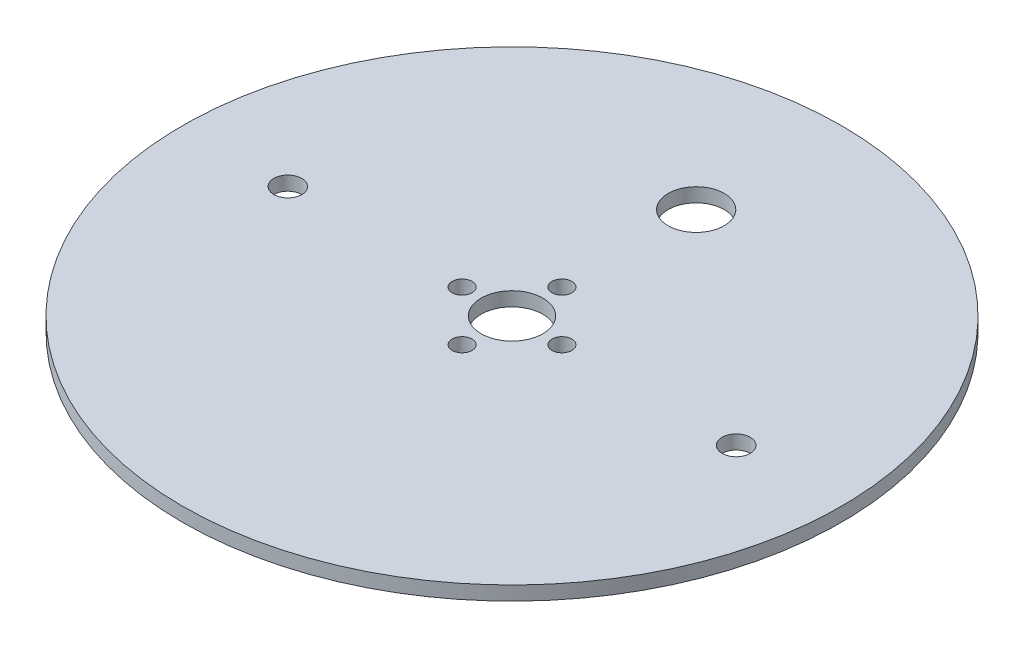
ISO-10303-21;
HEADER;
FILE_DESCRIPTION(('STEP AP214'),'2;1');
FILE_NAME('part.step','',(''),(''),'','','');
FILE_SCHEMA(('AUTOMOTIVE_DESIGN { 1 0 10303 214 1 1 1 1 }'));
ENDSEC;
DATA;
#1=APPLICATION_CONTEXT('core data for automotive mechanical design processes');
#2=APPLICATION_PROTOCOL_DEFINITION('international standard','automotive_design',2000,#1);
#3=PRODUCT_CONTEXT('',#1,'mechanical');
#4=PRODUCT('Part','Part','',(#3));
#5=PRODUCT_RELATED_PRODUCT_CATEGORY('part','',(#4));
#6=PRODUCT_DEFINITION_FORMATION('','',#4);
#7=PRODUCT_DEFINITION_CONTEXT('part definition',#1,'design');
#8=PRODUCT_DEFINITION('design','',#6,#7);
#9=PRODUCT_DEFINITION_SHAPE('','',#8);
#10=(LENGTH_UNIT() NAMED_UNIT(*) SI_UNIT(.MILLI.,.METRE.));
#11=(NAMED_UNIT(*) PLANE_ANGLE_UNIT() SI_UNIT($,.RADIAN.));
#12=(NAMED_UNIT(*) SI_UNIT($,.STERADIAN.) SOLID_ANGLE_UNIT());
#13=UNCERTAINTY_MEASURE_WITH_UNIT(LENGTH_MEASURE(1.E-05),#10,'distance_accuracy_value','');
#14=(GEOMETRIC_REPRESENTATION_CONTEXT(3) GLOBAL_UNCERTAINTY_ASSIGNED_CONTEXT((#13)) GLOBAL_UNIT_ASSIGNED_CONTEXT((#10,
#11,#12)) REPRESENTATION_CONTEXT('',''));
#15=CARTESIAN_POINT('',(0.,0.,0.));
#16=DIRECTION('',(0.,0.,1.));
#17=DIRECTION('',(1.,0.,0.));
#18=AXIS2_PLACEMENT_3D('',#15,#16,#17);
#19=CARTESIAN_POINT('',(0.,3.175,0.));
#20=DIRECTION('',(0.,-1.,0.));
#21=DIRECTION('',(0.,0.,-1.));
#22=AXIS2_PLACEMENT_3D('',#19,#20,#21);
#23=CYLINDRICAL_SURFACE('',#22,74.676);
#24=CARTESIAN_POINT('',(0.,3.175,0.));
#25=DIRECTION('',(0.,1.,0.));
#26=DIRECTION('',(0.,0.,1.));
#27=AXIS2_PLACEMENT_3D('',#24,#25,#26);
#28=CIRCLE('',#27,74.676);
#29=CARTESIAN_POINT('',(0.,3.175,74.676));
#30=VERTEX_POINT('',#29);
#31=EDGE_CURVE('E10',#30,#30,#28,.T.);
#32=ORIENTED_EDGE('',*,*,#31,.F.);
#33=EDGE_LOOP('',(#32));
#34=FACE_BOUND('',#33,.T.);
#35=CARTESIAN_POINT('',(0.,0.,0.));
#36=DIRECTION('',(0.,1.,0.));
#37=DIRECTION('',(0.,0.,1.));
#38=AXIS2_PLACEMENT_3D('',#35,#36,#37);
#39=CIRCLE('',#38,74.676);
#40=CARTESIAN_POINT('',(0.,0.,74.676));
#41=VERTEX_POINT('',#40);
#42=EDGE_CURVE('E34',#41,#41,#39,.T.);
#43=ORIENTED_EDGE('',*,*,#42,.T.);
#44=EDGE_LOOP('',(#43));
#45=FACE_BOUND('',#44,.T.);
#46=ADVANCED_FACE('F31',(#34,#45),#23,.T.);
#47=CARTESIAN_POINT('',(0.,3.175,0.));
#48=DIRECTION('',(0.,1.,0.));
#49=DIRECTION('',(0.,0.,1.));
#50=AXIS2_PLACEMENT_3D('',#47,#48,#49);
#51=PLANE('',#50);
#52=CARTESIAN_POINT('',(0.,3.175,-41.7338254403277));
#53=DIRECTION('',(0.,1.,0.));
#54=DIRECTION('',(0.,0.,1.));
#55=AXIS2_PLACEMENT_3D('',#52,#53,#54);
#56=CIRCLE('',#55,6.35);
#57=CARTESIAN_POINT('',(0.,3.175,-35.3838254403277));
#58=VERTEX_POINT('',#57);
#59=EDGE_CURVE('E87',#58,#58,#56,.T.);
#60=ORIENTED_EDGE('',*,*,#59,.F.);
#61=EDGE_LOOP('',(#60));
#62=FACE_BOUND('',#61,.T.);
#63=CARTESIAN_POINT('',(50.8,3.175,0.));
#64=DIRECTION('',(0.,1.,0.));
#65=DIRECTION('',(0.,0.,1.));
#66=AXIS2_PLACEMENT_3D('',#63,#64,#65);
#67=CIRCLE('',#66,3.17499999999999);
#68=CARTESIAN_POINT('',(50.8,3.175,3.175));
#69=VERTEX_POINT('',#68);
#70=EDGE_CURVE('E80',#69,#69,#67,.T.);
#71=ORIENTED_EDGE('',*,*,#70,.F.);
#72=EDGE_LOOP('',(#71));
#73=FACE_BOUND('',#72,.T.);
#74=CARTESIAN_POINT('',(-50.8,3.175,0.));
#75=DIRECTION('',(0.,1.,0.));
#76=DIRECTION('',(0.,0.,1.));
#77=AXIS2_PLACEMENT_3D('',#74,#75,#76);
#78=CIRCLE('',#77,3.175);
#79=CARTESIAN_POINT('',(-50.8,3.175,3.17499999999999));
#80=VERTEX_POINT('',#79);
#81=EDGE_CURVE('E73',#80,#80,#78,.T.);
#82=ORIENTED_EDGE('',*,*,#81,.F.);
#83=EDGE_LOOP('',(#82));
#84=FACE_BOUND('',#83,.T.);
#85=CARTESIAN_POINT('',(11.314,3.175,0.));
#86=DIRECTION('',(0.,1.,0.));
#87=DIRECTION('',(0.,0.,1.));
#88=AXIS2_PLACEMENT_3D('',#85,#86,#87);
#89=CIRCLE('',#88,2.25);
#90=CARTESIAN_POINT('',(11.314,3.175,2.25));
#91=VERTEX_POINT('',#90);
#92=EDGE_CURVE('E68',#91,#91,#89,.T.);
#93=ORIENTED_EDGE('',*,*,#92,.F.);
#94=EDGE_LOOP('',(#93));
#95=FACE_BOUND('',#94,.T.);
#96=CARTESIAN_POINT('',(0.,3.175,11.314));
#97=DIRECTION('',(0.,1.,0.));
#98=DIRECTION('',(0.,0.,1.));
#99=AXIS2_PLACEMENT_3D('',#96,#97,#98);
#100=CIRCLE('',#99,2.25);
#101=CARTESIAN_POINT('',(0.,3.175,13.564));
#102=VERTEX_POINT('',#101);
#103=EDGE_CURVE('E62',#102,#102,#100,.T.);
#104=ORIENTED_EDGE('',*,*,#103,.F.);
#105=EDGE_LOOP('',(#104));
#106=FACE_BOUND('',#105,.T.);
#107=CARTESIAN_POINT('',(-11.314,3.175,0.));
#108=DIRECTION('',(0.,1.,0.));
#109=DIRECTION('',(0.,0.,1.));
#110=AXIS2_PLACEMENT_3D('',#107,#108,#109);
#111=CIRCLE('',#110,2.25);
#112=CARTESIAN_POINT('',(-11.314,3.175,2.25));
#113=VERTEX_POINT('',#112);
#114=EDGE_CURVE('E56',#113,#113,#111,.T.);
#115=ORIENTED_EDGE('',*,*,#114,.F.);
#116=EDGE_LOOP('',(#115));
#117=FACE_BOUND('',#116,.T.);
#118=CARTESIAN_POINT('',(0.,3.175,-11.314));
#119=DIRECTION('',(0.,1.,0.));
#120=DIRECTION('',(0.,0.,1.));
#121=AXIS2_PLACEMENT_3D('',#118,#119,#120);
#122=CIRCLE('',#121,2.25);
#123=CARTESIAN_POINT('',(0.,3.175,-9.064));
#124=VERTEX_POINT('',#123);
#125=EDGE_CURVE('E49',#124,#124,#122,.T.);
#126=ORIENTED_EDGE('',*,*,#125,.F.);
#127=EDGE_LOOP('',(#126));
#128=FACE_BOUND('',#127,.T.);
#129=CARTESIAN_POINT('',(0.,3.175,0.));
#130=DIRECTION('',(0.,1.,0.));
#131=DIRECTION('',(0.,0.,1.));
#132=AXIS2_PLACEMENT_3D('',#129,#130,#131);
#133=CIRCLE('',#132,7.);
#134=CARTESIAN_POINT('',(0.,3.175,7.));
#135=VERTEX_POINT('',#134);
#136=EDGE_CURVE('E43',#135,#135,#133,.T.);
#137=ORIENTED_EDGE('',*,*,#136,.F.);
#138=EDGE_LOOP('',(#137));
#139=FACE_BOUND('',#138,.T.);
#140=ORIENTED_EDGE('',*,*,#31,.T.);
#141=EDGE_LOOP('',(#140));
#142=FACE_BOUND('',#141,.T.);
#143=ADVANCED_FACE('F94',(#62,#73,#84,#95,#106,#117,#128,#139,#142),#51,.T.);
#144=CARTESIAN_POINT('',(0.,0.,0.));
#145=DIRECTION('',(0.,1.,0.));
#146=DIRECTION('',(0.,0.,1.));
#147=AXIS2_PLACEMENT_3D('',#144,#145,#146);
#148=PLANE('',#147);
#149=CARTESIAN_POINT('',(0.,0.,-41.7338254403277));
#150=DIRECTION('',(0.,1.,0.));
#151=DIRECTION('',(0.,0.,1.));
#152=AXIS2_PLACEMENT_3D('',#149,#150,#151);
#153=CIRCLE('',#152,6.35);
#154=CARTESIAN_POINT('',(0.,0.,-35.3838254403277));
#155=VERTEX_POINT('',#154);
#156=EDGE_CURVE('E77',#155,#155,#153,.F.);
#157=ORIENTED_EDGE('',*,*,#156,.F.);
#158=EDGE_LOOP('',(#157));
#159=FACE_BOUND('',#158,.T.);
#160=CARTESIAN_POINT('',(50.8,0.,0.));
#161=DIRECTION('',(0.,1.,0.));
#162=DIRECTION('',(0.,0.,1.));
#163=AXIS2_PLACEMENT_3D('',#160,#161,#162);
#164=CIRCLE('',#163,3.17499999999999);
#165=CARTESIAN_POINT('',(50.8,0.,3.175));
#166=VERTEX_POINT('',#165);
#167=EDGE_CURVE('E53',#166,#166,#164,.T.);
#168=ORIENTED_EDGE('',*,*,#167,.T.);
#169=EDGE_LOOP('',(#168));
#170=FACE_BOUND('',#169,.T.);
#171=CARTESIAN_POINT('',(-50.8,0.,0.));
#172=DIRECTION('',(0.,1.,0.));
#173=DIRECTION('',(0.,0.,1.));
#174=AXIS2_PLACEMENT_3D('',#171,#172,#173);
#175=CIRCLE('',#174,3.175);
#176=CARTESIAN_POINT('',(-50.8,0.,3.17499999999999));
#177=VERTEX_POINT('',#176);
#178=EDGE_CURVE('E76',#177,#177,#175,.T.);
#179=ORIENTED_EDGE('',*,*,#178,.T.);
#180=EDGE_LOOP('',(#179));
#181=FACE_BOUND('',#180,.T.);
#182=CARTESIAN_POINT('',(11.314,0.,0.));
#183=DIRECTION('',(0.,1.,0.));
#184=DIRECTION('',(0.,0.,1.));
#185=AXIS2_PLACEMENT_3D('',#182,#183,#184);
#186=CIRCLE('',#185,2.25);
#187=CARTESIAN_POINT('',(11.314,0.,2.25));
#188=VERTEX_POINT('',#187);
#189=EDGE_CURVE('E46',#188,#188,#186,.T.);
#190=ORIENTED_EDGE('',*,*,#189,.T.);
#191=EDGE_LOOP('',(#190));
#192=FACE_BOUND('',#191,.T.);
#193=CARTESIAN_POINT('',(0.,0.,11.314));
#194=DIRECTION('',(0.,1.,0.));
#195=DIRECTION('',(0.,0.,1.));
#196=AXIS2_PLACEMENT_3D('',#193,#194,#195);
#197=CIRCLE('',#196,2.25);
#198=CARTESIAN_POINT('',(0.,0.,13.564));
#199=VERTEX_POINT('',#198);
#200=EDGE_CURVE('E65',#199,#199,#197,.T.);
#201=ORIENTED_EDGE('',*,*,#200,.T.);
#202=EDGE_LOOP('',(#201));
#203=FACE_BOUND('',#202,.T.);
#204=CARTESIAN_POINT('',(-11.314,0.,0.));
#205=DIRECTION('',(0.,1.,0.));
#206=DIRECTION('',(0.,0.,1.));
#207=AXIS2_PLACEMENT_3D('',#204,#205,#206);
#208=CIRCLE('',#207,2.25);
#209=CARTESIAN_POINT('',(-11.314,0.,2.25));
#210=VERTEX_POINT('',#209);
#211=EDGE_CURVE('E59',#210,#210,#208,.T.);
#212=ORIENTED_EDGE('',*,*,#211,.T.);
#213=EDGE_LOOP('',(#212));
#214=FACE_BOUND('',#213,.T.);
#215=CARTESIAN_POINT('',(0.,0.,-11.314));
#216=DIRECTION('',(0.,1.,0.));
#217=DIRECTION('',(0.,0.,1.));
#218=AXIS2_PLACEMENT_3D('',#215,#216,#217);
#219=CIRCLE('',#218,2.25);
#220=CARTESIAN_POINT('',(0.,0.,-9.064));
#221=VERTEX_POINT('',#220);
#222=EDGE_CURVE('E52',#221,#221,#219,.T.);
#223=ORIENTED_EDGE('',*,*,#222,.T.);
#224=EDGE_LOOP('',(#223));
#225=FACE_BOUND('',#224,.T.);
#226=CARTESIAN_POINT('',(0.,0.,0.));
#227=DIRECTION('',(0.,1.,0.));
#228=DIRECTION('',(0.,0.,1.));
#229=AXIS2_PLACEMENT_3D('',#226,#227,#228);
#230=CIRCLE('',#229,7.);
#231=CARTESIAN_POINT('',(0.,0.,7.));
#232=VERTEX_POINT('',#231);
#233=EDGE_CURVE('E41',#232,#232,#230,.T.);
#234=ORIENTED_EDGE('',*,*,#233,.T.);
#235=EDGE_LOOP('',(#234));
#236=FACE_BOUND('',#235,.T.);
#237=ORIENTED_EDGE('',*,*,#42,.F.);
#238=EDGE_LOOP('',(#237));
#239=FACE_BOUND('',#238,.T.);
#240=ADVANCED_FACE('F97',(#159,#170,#181,#192,#203,#214,#225,#236,#239),#148,.F.);
#241=CARTESIAN_POINT('',(0.,0.,0.));
#242=DIRECTION('',(0.,1.,0.));
#243=DIRECTION('',(0.,0.,1.));
#244=AXIS2_PLACEMENT_3D('',#241,#242,#243);
#245=CYLINDRICAL_SURFACE('',#244,7.);
#246=ORIENTED_EDGE('',*,*,#233,.F.);
#247=EDGE_LOOP('',(#246));
#248=FACE_BOUND('',#247,.T.);
#249=ORIENTED_EDGE('',*,*,#136,.T.);
#250=EDGE_LOOP('',(#249));
#251=FACE_BOUND('',#250,.T.);
#252=ADVANCED_FACE('F113',(#248,#251),#245,.F.);
#253=CARTESIAN_POINT('',(0.,0.,-11.314));
#254=DIRECTION('',(0.,1.,0.));
#255=DIRECTION('',(0.,0.,1.));
#256=AXIS2_PLACEMENT_3D('',#253,#254,#255);
#257=CYLINDRICAL_SURFACE('',#256,2.25);
#258=ORIENTED_EDGE('',*,*,#222,.F.);
#259=EDGE_LOOP('',(#258));
#260=FACE_BOUND('',#259,.T.);
#261=ORIENTED_EDGE('',*,*,#125,.T.);
#262=EDGE_LOOP('',(#261));
#263=FACE_BOUND('',#262,.T.);
#264=ADVANCED_FACE('F115',(#260,#263),#257,.F.);
#265=CARTESIAN_POINT('',(-11.314,0.,0.));
#266=DIRECTION('',(0.,1.,0.));
#267=DIRECTION('',(0.,0.,1.));
#268=AXIS2_PLACEMENT_3D('',#265,#266,#267);
#269=CYLINDRICAL_SURFACE('',#268,2.25);
#270=ORIENTED_EDGE('',*,*,#211,.F.);
#271=EDGE_LOOP('',(#270));
#272=FACE_BOUND('',#271,.T.);
#273=ORIENTED_EDGE('',*,*,#114,.T.);
#274=EDGE_LOOP('',(#273));
#275=FACE_BOUND('',#274,.T.);
#276=ADVANCED_FACE('F122',(#272,#275),#269,.F.);
#277=CARTESIAN_POINT('',(0.,0.,11.314));
#278=DIRECTION('',(0.,1.,0.));
#279=DIRECTION('',(0.,0.,1.));
#280=AXIS2_PLACEMENT_3D('',#277,#278,#279);
#281=CYLINDRICAL_SURFACE('',#280,2.25);
#282=ORIENTED_EDGE('',*,*,#200,.F.);
#283=EDGE_LOOP('',(#282));
#284=FACE_BOUND('',#283,.T.);
#285=ORIENTED_EDGE('',*,*,#103,.T.);
#286=EDGE_LOOP('',(#285));
#287=FACE_BOUND('',#286,.T.);
#288=ADVANCED_FACE('F176',(#284,#287),#281,.F.);
#289=CARTESIAN_POINT('',(11.314,0.,0.));
#290=DIRECTION('',(0.,1.,0.));
#291=DIRECTION('',(0.,0.,1.));
#292=AXIS2_PLACEMENT_3D('',#289,#290,#291);
#293=CYLINDRICAL_SURFACE('',#292,2.25);
#294=ORIENTED_EDGE('',*,*,#189,.F.);
#295=EDGE_LOOP('',(#294));
#296=FACE_BOUND('',#295,.T.);
#297=ORIENTED_EDGE('',*,*,#92,.T.);
#298=EDGE_LOOP('',(#297));
#299=FACE_BOUND('',#298,.T.);
#300=ADVANCED_FACE('F168',(#296,#299),#293,.F.);
#301=CARTESIAN_POINT('',(-50.8,0.,0.));
#302=DIRECTION('',(0.,1.,0.));
#303=DIRECTION('',(0.,0.,1.));
#304=AXIS2_PLACEMENT_3D('',#301,#302,#303);
#305=CYLINDRICAL_SURFACE('',#304,3.175);
#306=ORIENTED_EDGE('',*,*,#178,.F.);
#307=EDGE_LOOP('',(#306));
#308=FACE_BOUND('',#307,.T.);
#309=ORIENTED_EDGE('',*,*,#81,.T.);
#310=EDGE_LOOP('',(#309));
#311=FACE_BOUND('',#310,.T.);
#312=ADVANCED_FACE('F161',(#308,#311),#305,.F.);
#313=CARTESIAN_POINT('',(50.8,0.,0.));
#314=DIRECTION('',(0.,1.,0.));
#315=DIRECTION('',(0.,0.,1.));
#316=AXIS2_PLACEMENT_3D('',#313,#314,#315);
#317=CYLINDRICAL_SURFACE('',#316,3.17499999999999);
#318=ORIENTED_EDGE('',*,*,#167,.F.);
#319=EDGE_LOOP('',(#318));
#320=FACE_BOUND('',#319,.T.);
#321=ORIENTED_EDGE('',*,*,#70,.T.);
#322=EDGE_LOOP('',(#321));
#323=FACE_BOUND('',#322,.T.);
#324=ADVANCED_FACE('F152',(#320,#323),#317,.F.);
#325=CARTESIAN_POINT('',(0.,-0.00100000000000013,-41.7338254403277));
#326=DIRECTION('',(0.,1.,0.));
#327=DIRECTION('',(0.,0.,1.));
#328=AXIS2_PLACEMENT_3D('',#325,#326,#327);
#329=CYLINDRICAL_SURFACE('',#328,6.35);
#330=ORIENTED_EDGE('',*,*,#59,.T.);
#331=EDGE_LOOP('',(#330));
#332=FACE_BOUND('',#331,.T.);
#333=ORIENTED_EDGE('',*,*,#156,.T.);
#334=EDGE_LOOP('',(#333));
#335=FACE_BOUND('',#334,.T.);
#336=ADVANCED_FACE('F91',(#332,#335),#329,.F.);
#337=CLOSED_SHELL('',(#46,#143,#240,#252,#264,#276,#288,#300,#312,#324,#336));
#338=MANIFOLD_SOLID_BREP('B2',#337);
#339=ADVANCED_BREP_SHAPE_REPRESENTATION('',(#18,#338),#14);
#340=SHAPE_DEFINITION_REPRESENTATION(#9,#339);
ENDSEC;
END-ISO-10303-21;
